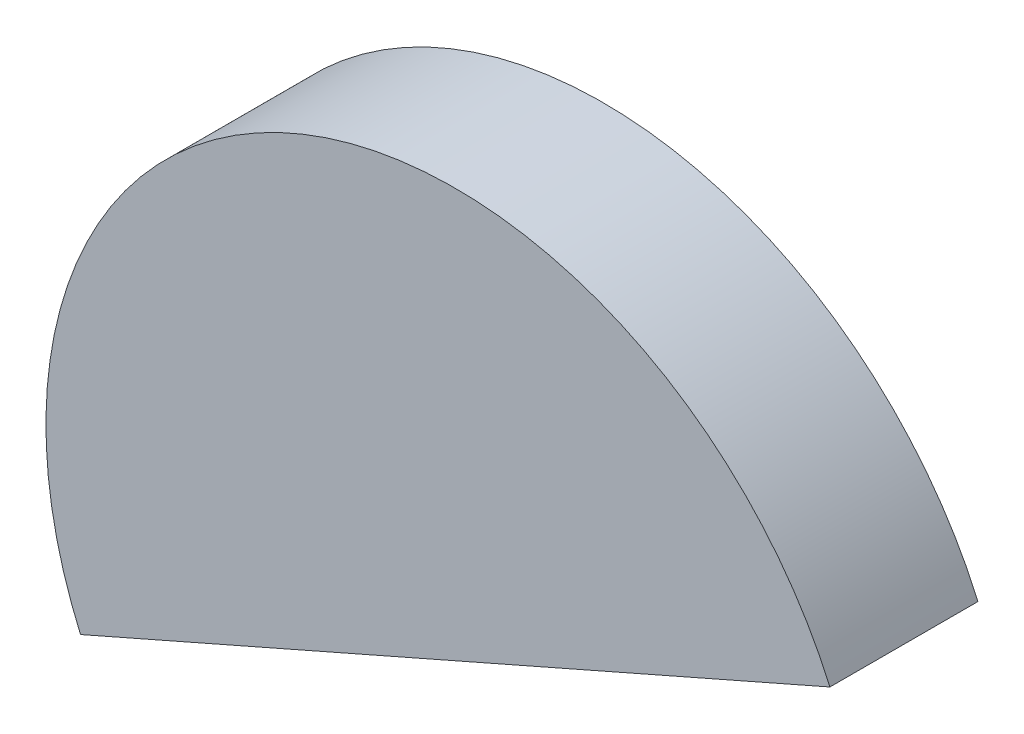
ISO-10303-21;
HEADER;
FILE_DESCRIPTION(('STEP AP214'),'2;1');
FILE_NAME('part.step','',(''),(''),'','','');
FILE_SCHEMA(('AUTOMOTIVE_DESIGN { 1 0 10303 214 1 1 1 1 }'));
ENDSEC;
DATA;
#1=APPLICATION_CONTEXT('core data for automotive mechanical design processes');
#2=APPLICATION_PROTOCOL_DEFINITION('international standard','automotive_design',2000,#1);
#3=PRODUCT_CONTEXT('',#1,'mechanical');
#4=PRODUCT('Part','Part','',(#3));
#5=PRODUCT_RELATED_PRODUCT_CATEGORY('part','',(#4));
#6=PRODUCT_DEFINITION_FORMATION('','',#4);
#7=PRODUCT_DEFINITION_CONTEXT('part definition',#1,'design');
#8=PRODUCT_DEFINITION('design','',#6,#7);
#9=PRODUCT_DEFINITION_SHAPE('','',#8);
#10=(LENGTH_UNIT() NAMED_UNIT(*) SI_UNIT(.MILLI.,.METRE.));
#11=(NAMED_UNIT(*) PLANE_ANGLE_UNIT() SI_UNIT($,.RADIAN.));
#12=(NAMED_UNIT(*) SI_UNIT($,.STERADIAN.) SOLID_ANGLE_UNIT());
#13=UNCERTAINTY_MEASURE_WITH_UNIT(LENGTH_MEASURE(1.E-05),#10,'distance_accuracy_value','');
#14=(GEOMETRIC_REPRESENTATION_CONTEXT(3) GLOBAL_UNCERTAINTY_ASSIGNED_CONTEXT((#13)) GLOBAL_UNIT_ASSIGNED_CONTEXT((#10,
#11,#12)) REPRESENTATION_CONTEXT('',''));
#15=CARTESIAN_POINT('',(0.,0.,0.));
#16=DIRECTION('',(0.,0.,1.));
#17=DIRECTION('',(1.,0.,0.));
#18=AXIS2_PLACEMENT_3D('',#15,#16,#17);
#19=CARTESIAN_POINT('',(-5.137,13.719,7.139));
#20=DIRECTION('',(0.,0.,-1.));
#21=DIRECTION('',(-1.,0.,0.));
#22=AXIS2_PLACEMENT_3D('',#19,#20,#21);
#23=CYLINDRICAL_SURFACE('',#22,19.731);
#24=CARTESIAN_POINT('',(-5.137,13.719,0.));
#25=DIRECTION('',(0.,0.,1.));
#26=DIRECTION('',(1.,0.,0.));
#27=AXIS2_PLACEMENT_3D('',#24,#25,#26);
#28=CIRCLE('',#27,19.731);
#29=CARTESIAN_POINT('',(12.9273076725018,21.6558223687564,0.));
#30=VERTEX_POINT('',#29);
#31=CARTESIAN_POINT('',(-23.2013076725018,5.78217763124362,0.));
#32=VERTEX_POINT('',#31);
#33=EDGE_CURVE('E74',#30,#32,#28,.T.);
#34=ORIENTED_EDGE('',*,*,#33,.T.);
#35=DIRECTION('',(0.,0.,-1.));
#36=VECTOR('',#35,1.);
#37=CARTESIAN_POINT('',(-23.2013076725018,5.78217763124362,7.139));
#38=LINE('',#37,#36);
#39=CARTESIAN_POINT('',(-23.2013076725018,5.78217763124362,7.139));
#40=VERTEX_POINT('',#39);
#41=EDGE_CURVE('E11',#40,#32,#38,.T.);
#42=ORIENTED_EDGE('',*,*,#41,.F.);
#43=CARTESIAN_POINT('',(-5.137,13.719,7.139));
#44=DIRECTION('',(0.,0.,1.));
#45=DIRECTION('',(1.,0.,0.));
#46=AXIS2_PLACEMENT_3D('',#43,#44,#45);
#47=CIRCLE('',#46,19.731);
#48=CARTESIAN_POINT('',(12.9273076725018,21.6558223687564,7.139));
#49=VERTEX_POINT('',#48);
#50=EDGE_CURVE('E72',#49,#40,#47,.T.);
#51=ORIENTED_EDGE('',*,*,#50,.F.);
#52=DIRECTION('',(0.,0.,-1.));
#53=VECTOR('',#52,1.);
#54=CARTESIAN_POINT('',(12.9273076725018,21.6558223687564,7.139));
#55=LINE('',#54,#53);
#56=EDGE_CURVE('E47',#49,#30,#55,.T.);
#57=ORIENTED_EDGE('',*,*,#56,.T.);
#58=EDGE_LOOP('',(#34,#42,#51,#57));
#59=FACE_BOUND('',#58,.T.);
#60=ADVANCED_FACE('F41',(#59),#23,.T.);
#61=CARTESIAN_POINT('',(-23.2013076725018,5.78217763124362,7.139));
#62=DIRECTION('',(-0.402251399764654,0.915529252065371,0.));
#63=DIRECTION('',(-0.915529252065371,-0.402251399764654,0.));
#64=AXIS2_PLACEMENT_3D('',#61,#62,#63);
#65=PLANE('',#64);
#66=DIRECTION('',(0.915529252065371,0.402251399764654,0.));
#67=VECTOR('',#66,1.);
#68=CARTESIAN_POINT('',(-23.2013076725018,5.78217763124362,0.));
#69=LINE('',#68,#67);
#70=EDGE_CURVE('E61',#32,#30,#69,.T.);
#71=ORIENTED_EDGE('',*,*,#70,.T.);
#72=ORIENTED_EDGE('',*,*,#56,.F.);
#73=DIRECTION('',(0.915529252065371,0.402251399764654,0.));
#74=VECTOR('',#73,1.);
#75=CARTESIAN_POINT('',(-23.2013076725018,5.78217763124362,7.139));
#76=LINE('',#75,#74);
#77=EDGE_CURVE('E57',#40,#49,#76,.T.);
#78=ORIENTED_EDGE('',*,*,#77,.F.);
#79=ORIENTED_EDGE('',*,*,#41,.T.);
#80=EDGE_LOOP('',(#71,#72,#78,#79));
#81=FACE_BOUND('',#80,.T.);
#82=ADVANCED_FACE('F70',(#81),#65,.F.);
#83=CARTESIAN_POINT('',(-5.137,13.719,7.139));
#84=DIRECTION('',(0.,0.,1.));
#85=DIRECTION('',(1.,0.,0.));
#86=AXIS2_PLACEMENT_3D('',#83,#84,#85);
#87=PLANE('',#86);
#88=ORIENTED_EDGE('',*,*,#50,.T.);
#89=ORIENTED_EDGE('',*,*,#77,.T.);
#90=EDGE_LOOP('',(#88,#89));
#91=FACE_BOUND('',#90,.T.);
#92=ADVANCED_FACE('F80',(#91),#87,.T.);
#93=CARTESIAN_POINT('',(-5.137,13.719,0.));
#94=DIRECTION('',(0.,0.,1.));
#95=DIRECTION('',(1.,0.,0.));
#96=AXIS2_PLACEMENT_3D('',#93,#94,#95);
#97=PLANE('',#96);
#98=ORIENTED_EDGE('',*,*,#33,.F.);
#99=ORIENTED_EDGE('',*,*,#70,.F.);
#100=EDGE_LOOP('',(#98,#99));
#101=FACE_BOUND('',#100,.T.);
#102=ADVANCED_FACE('F73',(#101),#97,.F.);
#103=CLOSED_SHELL('',(#60,#82,#92,#102));
#104=MANIFOLD_SOLID_BREP('B2',#103);
#105=ADVANCED_BREP_SHAPE_REPRESENTATION('',(#18,#104),#14);
#106=SHAPE_DEFINITION_REPRESENTATION(#9,#105);
ENDSEC;
END-ISO-10303-21;
